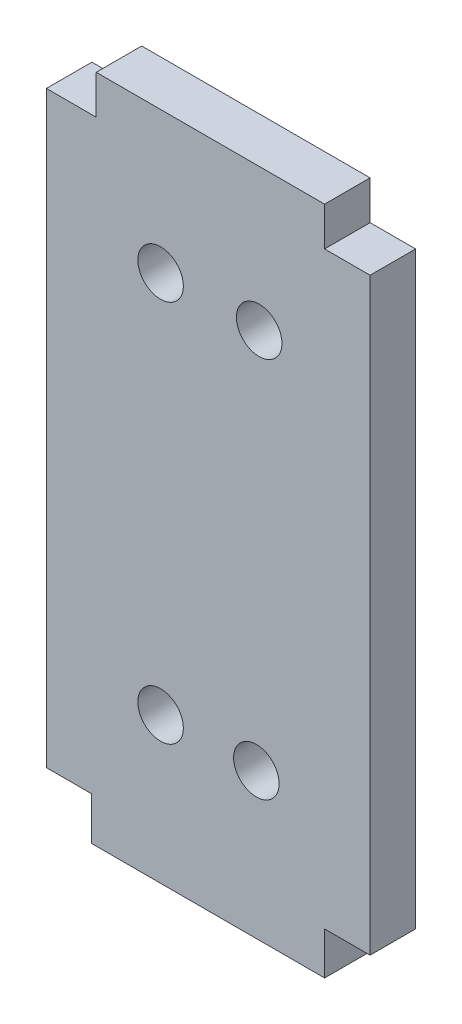
ISO-10303-21;
HEADER;
FILE_DESCRIPTION(('STEP AP214'),'2;1');
FILE_NAME('part.step','',(''),(''),'','','');
FILE_SCHEMA(('AUTOMOTIVE_DESIGN { 1 0 10303 214 1 1 1 1 }'));
ENDSEC;
DATA;
#1=APPLICATION_CONTEXT('core data for automotive mechanical design processes');
#2=APPLICATION_PROTOCOL_DEFINITION('international standard','automotive_design',2000,#1);
#3=PRODUCT_CONTEXT('',#1,'mechanical');
#4=PRODUCT('Part','Part','',(#3));
#5=PRODUCT_RELATED_PRODUCT_CATEGORY('part','',(#4));
#6=PRODUCT_DEFINITION_FORMATION('','',#4);
#7=PRODUCT_DEFINITION_CONTEXT('part definition',#1,'design');
#8=PRODUCT_DEFINITION('design','',#6,#7);
#9=PRODUCT_DEFINITION_SHAPE('','',#8);
#10=(LENGTH_UNIT() NAMED_UNIT(*) SI_UNIT(.MILLI.,.METRE.));
#11=(NAMED_UNIT(*) PLANE_ANGLE_UNIT() SI_UNIT($,.RADIAN.));
#12=(NAMED_UNIT(*) SI_UNIT($,.STERADIAN.) SOLID_ANGLE_UNIT());
#13=UNCERTAINTY_MEASURE_WITH_UNIT(LENGTH_MEASURE(1.E-05),#10,'distance_accuracy_value','');
#14=(GEOMETRIC_REPRESENTATION_CONTEXT(3) GLOBAL_UNCERTAINTY_ASSIGNED_CONTEXT((#13)) GLOBAL_UNIT_ASSIGNED_CONTEXT((#10,
#11,#12)) REPRESENTATION_CONTEXT('',''));
#15=CARTESIAN_POINT('',(0.,0.,0.));
#16=DIRECTION('',(0.,0.,1.));
#17=DIRECTION('',(1.,0.,0.));
#18=AXIS2_PLACEMENT_3D('',#15,#16,#17);
#19=CARTESIAN_POINT('',(-51.8315639018212,0.,5.08));
#20=DIRECTION('',(-1.,0.,0.));
#21=DIRECTION('',(0.,0.,1.));
#22=AXIS2_PLACEMENT_3D('',#19,#20,#21);
#23=PLANE('',#22);
#24=DIRECTION('',(0.,1.,0.));
#25=VECTOR('',#24,1.);
#26=CARTESIAN_POINT('',(-51.8315639018212,0.,0.));
#27=LINE('',#26,#25);
#28=CARTESIAN_POINT('',(-51.8315639018212,57.1986375692077,0.));
#29=VERTEX_POINT('',#28);
#30=CARTESIAN_POINT('',(-51.8315639018212,62.0025688853101,0.));
#31=VERTEX_POINT('',#30);
#32=EDGE_CURVE('E169',#29,#31,#27,.T.);
#33=ORIENTED_EDGE('',*,*,#32,.F.);
#34=DIRECTION('',(0.,0.,-1.));
#35=VECTOR('',#34,1.);
#36=CARTESIAN_POINT('',(-51.8315639018212,57.1986375692077,5.08));
#37=LINE('',#36,#35);
#38=CARTESIAN_POINT('',(-51.8315639018212,57.1986375692077,5.08));
#39=VERTEX_POINT('',#38);
#40=EDGE_CURVE('E11',#39,#29,#37,.T.);
#41=ORIENTED_EDGE('',*,*,#40,.F.);
#42=DIRECTION('',(0.,1.,0.));
#43=VECTOR('',#42,1.);
#44=CARTESIAN_POINT('',(-51.8315639018212,0.,5.08));
#45=LINE('',#44,#43);
#46=CARTESIAN_POINT('',(-51.8315639018212,62.0025688853101,5.08));
#47=VERTEX_POINT('',#46);
#48=EDGE_CURVE('E250',#39,#47,#45,.T.);
#49=ORIENTED_EDGE('',*,*,#48,.T.);
#50=DIRECTION('',(0.,0.,-1.));
#51=VECTOR('',#50,1.);
#52=CARTESIAN_POINT('',(-51.8315639018212,62.0025688853101,5.08));
#53=LINE('',#52,#51);
#54=EDGE_CURVE('E99',#47,#31,#53,.T.);
#55=ORIENTED_EDGE('',*,*,#54,.T.);
#56=EDGE_LOOP('',(#33,#41,#49,#55));
#57=FACE_BOUND('',#56,.T.);
#58=ADVANCED_FACE('F35',(#57),#23,.T.);
#59=CARTESIAN_POINT('',(0.,57.1986375692077,5.08));
#60=DIRECTION('',(0.,-1.,0.));
#61=DIRECTION('',(0.,0.,-1.));
#62=AXIS2_PLACEMENT_3D('',#59,#60,#61);
#63=PLANE('',#62);
#64=DIRECTION('',(-1.,0.,0.));
#65=VECTOR('',#64,1.);
#66=CARTESIAN_POINT('',(0.,57.1986375692077,0.));
#67=LINE('',#66,#65);
#68=CARTESIAN_POINT('',(-25.7868973944509,57.1986375692077,0.));
#69=VERTEX_POINT('',#68);
#70=EDGE_CURVE('E171',#69,#29,#67,.T.);
#71=ORIENTED_EDGE('',*,*,#70,.F.);
#72=DIRECTION('',(0.,0.,-1.));
#73=VECTOR('',#72,1.);
#74=CARTESIAN_POINT('',(-25.7868973944509,57.1986375692077,5.08));
#75=LINE('',#74,#73);
#76=CARTESIAN_POINT('',(-25.7868973944509,57.1986375692077,5.08));
#77=VERTEX_POINT('',#76);
#78=EDGE_CURVE('E44',#77,#69,#75,.T.);
#79=ORIENTED_EDGE('',*,*,#78,.F.);
#80=DIRECTION('',(-1.,0.,0.));
#81=VECTOR('',#80,1.);
#82=CARTESIAN_POINT('',(0.,57.1986375692077,5.08));
#83=LINE('',#82,#81);
#84=EDGE_CURVE('E246',#77,#39,#83,.T.);
#85=ORIENTED_EDGE('',*,*,#84,.T.);
#86=ORIENTED_EDGE('',*,*,#40,.T.);
#87=EDGE_LOOP('',(#71,#79,#85,#86));
#88=FACE_BOUND('',#87,.T.);
#89=ADVANCED_FACE('F233',(#88),#63,.T.);
#90=CARTESIAN_POINT('',(-25.7868973944509,0.,5.08));
#91=DIRECTION('',(1.,0.,0.));
#92=DIRECTION('',(0.,0.,-1.));
#93=AXIS2_PLACEMENT_3D('',#90,#91,#92);
#94=PLANE('',#93);
#95=DIRECTION('',(0.,-1.,0.));
#96=VECTOR('',#95,1.);
#97=CARTESIAN_POINT('',(-25.7868973944509,0.,0.));
#98=LINE('',#97,#96);
#99=CARTESIAN_POINT('',(-25.7868973944509,61.9436734756835,0.));
#100=VERTEX_POINT('',#99);
#101=EDGE_CURVE('E174',#100,#69,#98,.T.);
#102=ORIENTED_EDGE('',*,*,#101,.F.);
#103=DIRECTION('',(0.,0.,-1.));
#104=VECTOR('',#103,1.);
#105=CARTESIAN_POINT('',(-25.7868973944509,61.9436734756835,5.08));
#106=LINE('',#105,#104);
#107=CARTESIAN_POINT('',(-25.7868973944509,61.9436734756835,5.08));
#108=VERTEX_POINT('',#107);
#109=EDGE_CURVE('E222',#108,#100,#106,.T.);
#110=ORIENTED_EDGE('',*,*,#109,.F.);
#111=DIRECTION('',(0.,-1.,0.));
#112=VECTOR('',#111,1.);
#113=CARTESIAN_POINT('',(-25.7868973944509,0.,5.08));
#114=LINE('',#113,#112);
#115=EDGE_CURVE('E229',#108,#77,#114,.T.);
#116=ORIENTED_EDGE('',*,*,#115,.T.);
#117=ORIENTED_EDGE('',*,*,#78,.T.);
#118=EDGE_LOOP('',(#102,#110,#116,#117));
#119=FACE_BOUND('',#118,.T.);
#120=ADVANCED_FACE('F227',(#119),#94,.T.);
#121=CARTESIAN_POINT('',(0.,61.9436734756835,5.08));
#122=DIRECTION('',(0.,-1.,0.));
#123=DIRECTION('',(0.,0.,-1.));
#124=AXIS2_PLACEMENT_3D('',#121,#122,#123);
#125=PLANE('',#124);
#126=DIRECTION('',(-1.,0.,0.));
#127=VECTOR('',#126,1.);
#128=CARTESIAN_POINT('',(0.,61.9436734756835,0.));
#129=LINE('',#128,#127);
#130=CARTESIAN_POINT('',(-20.7068973944509,61.9436734756835,0.));
#131=VERTEX_POINT('',#130);
#132=EDGE_CURVE('E177',#131,#100,#129,.T.);
#133=ORIENTED_EDGE('',*,*,#132,.F.);
#134=DIRECTION('',(0.,0.,-1.));
#135=VECTOR('',#134,1.);
#136=CARTESIAN_POINT('',(-20.7068973944509,61.9436734756835,5.08));
#137=LINE('',#136,#135);
#138=CARTESIAN_POINT('',(-20.7068973944509,61.9436734756835,5.08));
#139=VERTEX_POINT('',#138);
#140=EDGE_CURVE('E220',#139,#131,#137,.T.);
#141=ORIENTED_EDGE('',*,*,#140,.F.);
#142=DIRECTION('',(-1.,0.,0.));
#143=VECTOR('',#142,1.);
#144=CARTESIAN_POINT('',(0.,61.9436734756835,5.08));
#145=LINE('',#144,#143);
#146=EDGE_CURVE('E243',#139,#108,#145,.T.);
#147=ORIENTED_EDGE('',*,*,#146,.T.);
#148=ORIENTED_EDGE('',*,*,#109,.T.);
#149=EDGE_LOOP('',(#133,#141,#147,#148));
#150=FACE_BOUND('',#149,.T.);
#151=ADVANCED_FACE('F240',(#150),#125,.T.);
#152=CARTESIAN_POINT('',(-20.7068973944509,0.,5.08));
#153=DIRECTION('',(1.,0.,0.));
#154=DIRECTION('',(0.,0.,-1.));
#155=AXIS2_PLACEMENT_3D('',#152,#153,#154);
#156=PLANE('',#155);
#157=DIRECTION('',(0.,-1.,0.));
#158=VECTOR('',#157,1.);
#159=CARTESIAN_POINT('',(-20.7068973944509,0.,0.));
#160=LINE('',#159,#158);
#161=CARTESIAN_POINT('',(-20.7068973944509,127.673122897738,0.));
#162=VERTEX_POINT('',#161);
#163=EDGE_CURVE('E180',#162,#131,#160,.T.);
#164=ORIENTED_EDGE('',*,*,#163,.F.);
#165=DIRECTION('',(0.,0.,-1.));
#166=VECTOR('',#165,1.);
#167=CARTESIAN_POINT('',(-20.7068973944509,127.673122897738,5.08));
#168=LINE('',#167,#166);
#169=CARTESIAN_POINT('',(-20.7068973944509,127.673122897738,5.08));
#170=VERTEX_POINT('',#169);
#171=EDGE_CURVE('E218',#170,#162,#168,.T.);
#172=ORIENTED_EDGE('',*,*,#171,.F.);
#173=DIRECTION('',(0.,-1.,0.));
#174=VECTOR('',#173,1.);
#175=CARTESIAN_POINT('',(-20.7068973944509,0.,5.08));
#176=LINE('',#175,#174);
#177=EDGE_CURVE('E248',#170,#139,#176,.T.);
#178=ORIENTED_EDGE('',*,*,#177,.T.);
#179=ORIENTED_EDGE('',*,*,#140,.T.);
#180=EDGE_LOOP('',(#164,#172,#178,#179));
#181=FACE_BOUND('',#180,.T.);
#182=ADVANCED_FACE('F273',(#181),#156,.T.);
#183=CARTESIAN_POINT('',(0.,127.673122897738,5.08));
#184=DIRECTION('',(0.,-1.,0.));
#185=DIRECTION('',(0.,0.,-1.));
#186=AXIS2_PLACEMENT_3D('',#183,#184,#185);
#187=PLANE('',#186);
#188=DIRECTION('',(-1.,0.,0.));
#189=VECTOR('',#188,1.);
#190=CARTESIAN_POINT('',(0.,127.673122897738,0.));
#191=LINE('',#190,#189);
#192=CARTESIAN_POINT('',(-25.7868973944509,127.673122897738,0.));
#193=VERTEX_POINT('',#192);
#194=EDGE_CURVE('E183',#162,#193,#191,.T.);
#195=ORIENTED_EDGE('',*,*,#194,.T.);
#196=DIRECTION('',(0.,0.,-1.));
#197=VECTOR('',#196,1.);
#198=CARTESIAN_POINT('',(-25.7868973944509,127.673122897738,5.08));
#199=LINE('',#198,#197);
#200=CARTESIAN_POINT('',(-25.7868973944509,127.673122897738,5.08));
#201=VERTEX_POINT('',#200);
#202=EDGE_CURVE('E215',#201,#193,#199,.T.);
#203=ORIENTED_EDGE('',*,*,#202,.F.);
#204=DIRECTION('',(-1.,0.,0.));
#205=VECTOR('',#204,1.);
#206=CARTESIAN_POINT('',(0.,127.673122897738,5.08));
#207=LINE('',#206,#205);
#208=EDGE_CURVE('E255',#170,#201,#207,.T.);
#209=ORIENTED_EDGE('',*,*,#208,.F.);
#210=ORIENTED_EDGE('',*,*,#171,.T.);
#211=EDGE_LOOP('',(#195,#203,#209,#210));
#212=FACE_BOUND('',#211,.T.);
#213=ADVANCED_FACE('F271',(#212),#187,.F.);
#214=CARTESIAN_POINT('',(-25.7868973944509,0.,5.08));
#215=DIRECTION('',(-1.,0.,0.));
#216=DIRECTION('',(0.,0.,1.));
#217=AXIS2_PLACEMENT_3D('',#214,#215,#216);
#218=PLANE('',#217);
#219=DIRECTION('',(0.,1.,0.));
#220=VECTOR('',#219,1.);
#221=CARTESIAN_POINT('',(-25.7868973944509,0.,0.));
#222=LINE('',#221,#220);
#223=CARTESIAN_POINT('',(-25.7868973944509,132.00359166197,0.));
#224=VERTEX_POINT('',#223);
#225=EDGE_CURVE('E186',#193,#224,#222,.T.);
#226=ORIENTED_EDGE('',*,*,#225,.T.);
#227=DIRECTION('',(0.,0.,-1.));
#228=VECTOR('',#227,1.);
#229=CARTESIAN_POINT('',(-25.7868973944509,132.00359166197,5.08));
#230=LINE('',#229,#228);
#231=CARTESIAN_POINT('',(-25.7868973944509,132.00359166197,5.08));
#232=VERTEX_POINT('',#231);
#233=EDGE_CURVE('E212',#232,#224,#230,.T.);
#234=ORIENTED_EDGE('',*,*,#233,.F.);
#235=DIRECTION('',(0.,1.,0.));
#236=VECTOR('',#235,1.);
#237=CARTESIAN_POINT('',(-25.7868973944509,0.,5.08));
#238=LINE('',#237,#236);
#239=EDGE_CURVE('E258',#201,#232,#238,.T.);
#240=ORIENTED_EDGE('',*,*,#239,.F.);
#241=ORIENTED_EDGE('',*,*,#202,.T.);
#242=EDGE_LOOP('',(#226,#234,#240,#241));
#243=FACE_BOUND('',#242,.T.);
#244=ADVANCED_FACE('F267',(#243),#218,.F.);
#245=CARTESIAN_POINT('',(0.,132.00359166197,5.08));
#246=DIRECTION('',(0.,-1.,0.));
#247=DIRECTION('',(0.,0.,-1.));
#248=AXIS2_PLACEMENT_3D('',#245,#246,#247);
#249=PLANE('',#248);
#250=DIRECTION('',(-1.,0.,0.));
#251=VECTOR('',#250,1.);
#252=CARTESIAN_POINT('',(0.,132.00359166197,0.));
#253=LINE('',#252,#251);
#254=CARTESIAN_POINT('',(-51.2790971994193,132.00359166197,0.));
#255=VERTEX_POINT('',#254);
#256=EDGE_CURVE('E189',#224,#255,#253,.T.);
#257=ORIENTED_EDGE('',*,*,#256,.T.);
#258=DIRECTION('',(0.,0.,-1.));
#259=VECTOR('',#258,1.);
#260=CARTESIAN_POINT('',(-51.2790971994193,132.00359166197,5.08));
#261=LINE('',#260,#259);
#262=CARTESIAN_POINT('',(-51.2790971994193,132.00359166197,5.08));
#263=VERTEX_POINT('',#262);
#264=EDGE_CURVE('E209',#263,#255,#261,.T.);
#265=ORIENTED_EDGE('',*,*,#264,.F.);
#266=DIRECTION('',(-1.,0.,0.));
#267=VECTOR('',#266,1.);
#268=CARTESIAN_POINT('',(0.,132.00359166197,5.08));
#269=LINE('',#268,#267);
#270=EDGE_CURVE('E152',#232,#263,#269,.T.);
#271=ORIENTED_EDGE('',*,*,#270,.F.);
#272=ORIENTED_EDGE('',*,*,#233,.T.);
#273=EDGE_LOOP('',(#257,#265,#271,#272));
#274=FACE_BOUND('',#273,.T.);
#275=ADVANCED_FACE('F263',(#274),#249,.F.);
#276=CARTESIAN_POINT('',(-51.2790971994193,0.,5.08));
#277=DIRECTION('',(1.,0.,0.));
#278=DIRECTION('',(0.,0.,-1.));
#279=AXIS2_PLACEMENT_3D('',#276,#277,#278);
#280=PLANE('',#279);
#281=DIRECTION('',(0.,-1.,0.));
#282=VECTOR('',#281,1.);
#283=CARTESIAN_POINT('',(-51.2790971994193,0.,0.));
#284=LINE('',#283,#282);
#285=CARTESIAN_POINT('',(-51.2790971994193,127.662023864133,0.));
#286=VERTEX_POINT('',#285);
#287=EDGE_CURVE('E192',#255,#286,#284,.T.);
#288=ORIENTED_EDGE('',*,*,#287,.T.);
#289=DIRECTION('',(0.,0.,-1.));
#290=VECTOR('',#289,1.);
#291=CARTESIAN_POINT('',(-51.2790971994193,127.662023864133,5.08));
#292=LINE('',#291,#290);
#293=CARTESIAN_POINT('',(-51.2790971994193,127.662023864133,5.08));
#294=VERTEX_POINT('',#293);
#295=EDGE_CURVE('E139',#294,#286,#292,.T.);
#296=ORIENTED_EDGE('',*,*,#295,.F.);
#297=DIRECTION('',(0.,-1.,0.));
#298=VECTOR('',#297,1.);
#299=CARTESIAN_POINT('',(-51.2790971994193,0.,5.08));
#300=LINE('',#299,#298);
#301=EDGE_CURVE('E149',#263,#294,#300,.T.);
#302=ORIENTED_EDGE('',*,*,#301,.F.);
#303=ORIENTED_EDGE('',*,*,#264,.T.);
#304=EDGE_LOOP('',(#288,#296,#302,#303));
#305=FACE_BOUND('',#304,.T.);
#306=ADVANCED_FACE('F265',(#305),#280,.F.);
#307=CARTESIAN_POINT('',(0.,127.662023864133,5.08));
#308=DIRECTION('',(0.,1.,0.));
#309=DIRECTION('',(0.,0.,1.));
#310=AXIS2_PLACEMENT_3D('',#307,#308,#309);
#311=PLANE('',#310);
#312=DIRECTION('',(1.,0.,0.));
#313=VECTOR('',#312,1.);
#314=CARTESIAN_POINT('',(0.,127.662023864133,0.));
#315=LINE('',#314,#313);
#316=CARTESIAN_POINT('',(-56.8403376125097,127.662023864133,0.));
#317=VERTEX_POINT('',#316);
#318=EDGE_CURVE('E136',#317,#286,#315,.T.);
#319=ORIENTED_EDGE('',*,*,#318,.F.);
#320=DIRECTION('',(0.,0.,-1.));
#321=VECTOR('',#320,1.);
#322=CARTESIAN_POINT('',(-56.8403376125097,127.662023864133,5.08));
#323=LINE('',#322,#321);
#324=CARTESIAN_POINT('',(-56.8403376125097,127.662023864133,5.08));
#325=VERTEX_POINT('',#324);
#326=EDGE_CURVE('E130',#325,#317,#323,.T.);
#327=ORIENTED_EDGE('',*,*,#326,.F.);
#328=DIRECTION('',(1.,0.,0.));
#329=VECTOR('',#328,1.);
#330=CARTESIAN_POINT('',(0.,127.662023864133,5.08));
#331=LINE('',#330,#329);
#332=EDGE_CURVE('E134',#325,#294,#331,.T.);
#333=ORIENTED_EDGE('',*,*,#332,.T.);
#334=ORIENTED_EDGE('',*,*,#295,.T.);
#335=EDGE_LOOP('',(#319,#327,#333,#334));
#336=FACE_BOUND('',#335,.T.);
#337=ADVANCED_FACE('F132',(#336),#311,.T.);
#338=CARTESIAN_POINT('',(-56.8403376125097,0.,5.08));
#339=DIRECTION('',(1.,0.,0.));
#340=DIRECTION('',(0.,0.,-1.));
#341=AXIS2_PLACEMENT_3D('',#338,#339,#340);
#342=PLANE('',#341);
#343=DIRECTION('',(0.,-1.,0.));
#344=VECTOR('',#343,1.);
#345=CARTESIAN_POINT('',(-56.8403376125097,0.,0.));
#346=LINE('',#345,#344);
#347=CARTESIAN_POINT('',(-56.8403376125097,62.0025688853101,0.));
#348=VERTEX_POINT('',#347);
#349=EDGE_CURVE('E196',#317,#348,#346,.T.);
#350=ORIENTED_EDGE('',*,*,#349,.T.);
#351=DIRECTION('',(0.,0.,-1.));
#352=VECTOR('',#351,1.);
#353=CARTESIAN_POINT('',(-56.8403376125097,62.0025688853101,5.08));
#354=LINE('',#353,#352);
#355=CARTESIAN_POINT('',(-56.8403376125097,62.0025688853101,5.08));
#356=VERTEX_POINT('',#355);
#357=EDGE_CURVE('E140',#356,#348,#354,.T.);
#358=ORIENTED_EDGE('',*,*,#357,.F.);
#359=DIRECTION('',(0.,-1.,0.));
#360=VECTOR('',#359,1.);
#361=CARTESIAN_POINT('',(-56.8403376125097,0.,5.08));
#362=LINE('',#361,#360);
#363=EDGE_CURVE('E143',#325,#356,#362,.T.);
#364=ORIENTED_EDGE('',*,*,#363,.F.);
#365=ORIENTED_EDGE('',*,*,#326,.T.);
#366=EDGE_LOOP('',(#350,#358,#364,#365));
#367=FACE_BOUND('',#366,.T.);
#368=ADVANCED_FACE('F144',(#367),#342,.F.);
#369=CARTESIAN_POINT('',(-33.4052069952613,73.4316191634923,5.08));
#370=DIRECTION('',(0.,0.,-1.));
#371=DIRECTION('',(-1.,0.,0.));
#372=AXIS2_PLACEMENT_3D('',#369,#370,#371);
#373=CYLINDRICAL_SURFACE('',#372,2.54);
#374=CARTESIAN_POINT('',(-33.4052069952613,73.4316191634923,5.08));
#375=DIRECTION('',(0.,0.,1.));
#376=DIRECTION('',(1.,0.,0.));
#377=AXIS2_PLACEMENT_3D('',#374,#375,#376);
#378=CIRCLE('',#377,2.54);
#379=CARTESIAN_POINT('',(-30.8652069952613,73.4316191634923,5.08));
#380=VERTEX_POINT('',#379);
#381=EDGE_CURVE('E157',#380,#380,#378,.T.);
#382=ORIENTED_EDGE('',*,*,#381,.T.);
#383=EDGE_LOOP('',(#382));
#384=FACE_BOUND('',#383,.T.);
#385=CARTESIAN_POINT('',(-33.4052069952613,73.4316191634923,0.));
#386=DIRECTION('',(0.,0.,1.));
#387=DIRECTION('',(1.,0.,0.));
#388=AXIS2_PLACEMENT_3D('',#385,#386,#387);
#389=CIRCLE('',#388,2.54);
#390=CARTESIAN_POINT('',(-30.8652069952613,73.4316191634923,0.));
#391=VERTEX_POINT('',#390);
#392=EDGE_CURVE('E199',#391,#391,#389,.T.);
#393=ORIENTED_EDGE('',*,*,#392,.F.);
#394=EDGE_LOOP('',(#393));
#395=FACE_BOUND('',#394,.T.);
#396=ADVANCED_FACE('F299',(#384,#395),#373,.F.);
#397=CARTESIAN_POINT('',(0.,62.0025688853101,5.08));
#398=DIRECTION('',(0.,1.,0.));
#399=DIRECTION('',(0.,0.,1.));
#400=AXIS2_PLACEMENT_3D('',#397,#398,#399);
#401=PLANE('',#400);
#402=DIRECTION('',(1.,0.,0.));
#403=VECTOR('',#402,1.);
#404=CARTESIAN_POINT('',(0.,62.0025688853101,0.));
#405=LINE('',#404,#403);
#406=EDGE_CURVE('E92',#348,#31,#405,.T.);
#407=ORIENTED_EDGE('',*,*,#406,.T.);
#408=ORIENTED_EDGE('',*,*,#54,.F.);
#409=DIRECTION('',(1.,0.,0.));
#410=VECTOR('',#409,1.);
#411=CARTESIAN_POINT('',(0.,62.0025688853101,5.08));
#412=LINE('',#411,#410);
#413=EDGE_CURVE('E52',#356,#47,#412,.T.);
#414=ORIENTED_EDGE('',*,*,#413,.F.);
#415=ORIENTED_EDGE('',*,*,#357,.T.);
#416=EDGE_LOOP('',(#407,#408,#414,#415));
#417=FACE_BOUND('',#416,.T.);
#418=ADVANCED_FACE('F291',(#417),#401,.F.);
#419=CARTESIAN_POINT('',(-44.093221019268,116.193505799795,5.08));
#420=DIRECTION('',(0.,0.,-1.));
#421=DIRECTION('',(-1.,0.,0.));
#422=AXIS2_PLACEMENT_3D('',#419,#420,#421);
#423=CYLINDRICAL_SURFACE('',#422,2.54);
#424=CARTESIAN_POINT('',(-44.093221019268,116.193505799795,5.08));
#425=DIRECTION('',(0.,0.,1.));
#426=DIRECTION('',(1.,0.,0.));
#427=AXIS2_PLACEMENT_3D('',#424,#425,#426);
#428=CIRCLE('',#427,2.54);
#429=CARTESIAN_POINT('',(-41.553221019268,116.193505799795,5.08));
#430=VERTEX_POINT('',#429);
#431=EDGE_CURVE('E305',#430,#430,#428,.T.);
#432=ORIENTED_EDGE('',*,*,#431,.T.);
#433=EDGE_LOOP('',(#432));
#434=FACE_BOUND('',#433,.T.);
#435=CARTESIAN_POINT('',(-44.093221019268,116.193505799795,0.));
#436=DIRECTION('',(0.,0.,1.));
#437=DIRECTION('',(1.,0.,0.));
#438=AXIS2_PLACEMENT_3D('',#435,#436,#437);
#439=CIRCLE('',#438,2.54);
#440=CARTESIAN_POINT('',(-41.553221019268,116.193505799795,0.));
#441=VERTEX_POINT('',#440);
#442=EDGE_CURVE('E166',#441,#441,#439,.T.);
#443=ORIENTED_EDGE('',*,*,#442,.F.);
#444=EDGE_LOOP('',(#443));
#445=FACE_BOUND('',#444,.T.);
#446=ADVANCED_FACE('F289',(#434,#445),#423,.F.);
#447=CARTESIAN_POINT('',(-44.093221019268,73.4710869496482,5.08));
#448=DIRECTION('',(0.,0.,-1.));
#449=DIRECTION('',(-1.,0.,0.));
#450=AXIS2_PLACEMENT_3D('',#447,#448,#449);
#451=CYLINDRICAL_SURFACE('',#450,2.54);
#452=CARTESIAN_POINT('',(-44.093221019268,73.4710869496482,5.08));
#453=DIRECTION('',(0.,0.,1.));
#454=DIRECTION('',(1.,0.,0.));
#455=AXIS2_PLACEMENT_3D('',#452,#453,#454);
#456=CIRCLE('',#455,2.54);
#457=CARTESIAN_POINT('',(-41.553221019268,73.4710869496482,5.08));
#458=VERTEX_POINT('',#457);
#459=EDGE_CURVE('E205',#458,#458,#456,.F.);
#460=ORIENTED_EDGE('',*,*,#459,.F.);
#461=EDGE_LOOP('',(#460));
#462=FACE_BOUND('',#461,.T.);
#463=CARTESIAN_POINT('',(-44.093221019268,73.4710869496482,0.));
#464=DIRECTION('',(0.,0.,1.));
#465=DIRECTION('',(1.,0.,0.));
#466=AXIS2_PLACEMENT_3D('',#463,#464,#465);
#467=CIRCLE('',#466,2.54);
#468=CARTESIAN_POINT('',(-41.553221019268,73.4710869496482,0.));
#469=VERTEX_POINT('',#468);
#470=EDGE_CURVE('E163',#469,#469,#467,.F.);
#471=ORIENTED_EDGE('',*,*,#470,.T.);
#472=EDGE_LOOP('',(#471));
#473=FACE_BOUND('',#472,.T.);
#474=ADVANCED_FACE('F37',(#462,#473),#451,.F.);
#475=CARTESIAN_POINT('',(-33.0896878922625,116.152872891619,5.08));
#476=DIRECTION('',(0.,0.,-1.));
#477=DIRECTION('',(-1.,0.,0.));
#478=AXIS2_PLACEMENT_3D('',#475,#476,#477);
#479=CYLINDRICAL_SURFACE('',#478,2.54);
#480=CARTESIAN_POINT('',(-33.0896878922625,116.152872891619,5.08));
#481=DIRECTION('',(0.,0.,1.));
#482=DIRECTION('',(1.,0.,0.));
#483=AXIS2_PLACEMENT_3D('',#480,#481,#482);
#484=CIRCLE('',#483,2.54);
#485=CARTESIAN_POINT('',(-30.5496878922625,116.152872891619,5.08));
#486=VERTEX_POINT('',#485);
#487=EDGE_CURVE('E160',#486,#486,#484,.F.);
#488=ORIENTED_EDGE('',*,*,#487,.F.);
#489=EDGE_LOOP('',(#488));
#490=FACE_BOUND('',#489,.T.);
#491=CARTESIAN_POINT('',(-33.0896878922625,116.152872891619,0.));
#492=DIRECTION('',(0.,0.,1.));
#493=DIRECTION('',(1.,0.,0.));
#494=AXIS2_PLACEMENT_3D('',#491,#492,#493);
#495=CIRCLE('',#494,2.54);
#496=CARTESIAN_POINT('',(-30.5496878922625,116.152872891619,0.));
#497=VERTEX_POINT('',#496);
#498=EDGE_CURVE('E202',#497,#497,#495,.F.);
#499=ORIENTED_EDGE('',*,*,#498,.T.);
#500=EDGE_LOOP('',(#499));
#501=FACE_BOUND('',#500,.T.);
#502=ADVANCED_FACE('F297',(#490,#501),#479,.F.);
#503=CARTESIAN_POINT('',(0.,0.,5.08));
#504=DIRECTION('',(0.,0.,1.));
#505=DIRECTION('',(1.,0.,0.));
#506=AXIS2_PLACEMENT_3D('',#503,#504,#505);
#507=PLANE('',#506);
#508=ORIENTED_EDGE('',*,*,#459,.T.);
#509=EDGE_LOOP('',(#508));
#510=FACE_BOUND('',#509,.T.);
#511=ORIENTED_EDGE('',*,*,#431,.F.);
#512=EDGE_LOOP('',(#511));
#513=FACE_BOUND('',#512,.T.);
#514=ORIENTED_EDGE('',*,*,#48,.F.);
#515=ORIENTED_EDGE('',*,*,#84,.F.);
#516=ORIENTED_EDGE('',*,*,#115,.F.);
#517=ORIENTED_EDGE('',*,*,#146,.F.);
#518=ORIENTED_EDGE('',*,*,#177,.F.);
#519=ORIENTED_EDGE('',*,*,#208,.T.);
#520=ORIENTED_EDGE('',*,*,#239,.T.);
#521=ORIENTED_EDGE('',*,*,#270,.T.);
#522=ORIENTED_EDGE('',*,*,#301,.T.);
#523=ORIENTED_EDGE('',*,*,#332,.F.);
#524=ORIENTED_EDGE('',*,*,#363,.T.);
#525=ORIENTED_EDGE('',*,*,#413,.T.);
#526=EDGE_LOOP('',(#514,#515,#516,#517,#518,#519,#520,#521,#522,#523,#524,#525));
#527=FACE_BOUND('',#526,.T.);
#528=ORIENTED_EDGE('',*,*,#381,.F.);
#529=EDGE_LOOP('',(#528));
#530=FACE_BOUND('',#529,.T.);
#531=ORIENTED_EDGE('',*,*,#487,.T.);
#532=EDGE_LOOP('',(#531));
#533=FACE_BOUND('',#532,.T.);
#534=ADVANCED_FACE('F146',(#510,#513,#527,#530,#533),#507,.T.);
#535=CARTESIAN_POINT('',(0.,0.,0.));
#536=DIRECTION('',(0.,0.,1.));
#537=DIRECTION('',(1.,0.,0.));
#538=AXIS2_PLACEMENT_3D('',#535,#536,#537);
#539=PLANE('',#538);
#540=ORIENTED_EDGE('',*,*,#470,.F.);
#541=EDGE_LOOP('',(#540));
#542=FACE_BOUND('',#541,.T.);
#543=ORIENTED_EDGE('',*,*,#442,.T.);
#544=EDGE_LOOP('',(#543));
#545=FACE_BOUND('',#544,.T.);
#546=ORIENTED_EDGE('',*,*,#32,.T.);
#547=ORIENTED_EDGE('',*,*,#406,.F.);
#548=ORIENTED_EDGE('',*,*,#349,.F.);
#549=ORIENTED_EDGE('',*,*,#318,.T.);
#550=ORIENTED_EDGE('',*,*,#287,.F.);
#551=ORIENTED_EDGE('',*,*,#256,.F.);
#552=ORIENTED_EDGE('',*,*,#225,.F.);
#553=ORIENTED_EDGE('',*,*,#194,.F.);
#554=ORIENTED_EDGE('',*,*,#163,.T.);
#555=ORIENTED_EDGE('',*,*,#132,.T.);
#556=ORIENTED_EDGE('',*,*,#101,.T.);
#557=ORIENTED_EDGE('',*,*,#70,.T.);
#558=EDGE_LOOP('',(#546,#547,#548,#549,#550,#551,#552,#553,#554,#555,#556,#557));
#559=FACE_BOUND('',#558,.T.);
#560=ORIENTED_EDGE('',*,*,#392,.T.);
#561=EDGE_LOOP('',(#560));
#562=FACE_BOUND('',#561,.T.);
#563=ORIENTED_EDGE('',*,*,#498,.F.);
#564=EDGE_LOOP('',(#563));
#565=FACE_BOUND('',#564,.T.);
#566=ADVANCED_FACE('F234',(#542,#545,#559,#562,#565),#539,.F.);
#567=CLOSED_SHELL('',(#58,#89,#120,#151,#182,#213,#244,#275,#306,#337,#368,#396,#418,#446,#474,
#502,#534,#566));
#568=MANIFOLD_SOLID_BREP('B2',#567);
#569=ADVANCED_BREP_SHAPE_REPRESENTATION('',(#18,#568),#14);
#570=SHAPE_DEFINITION_REPRESENTATION(#9,#569);
ENDSEC;
END-ISO-10303-21;
